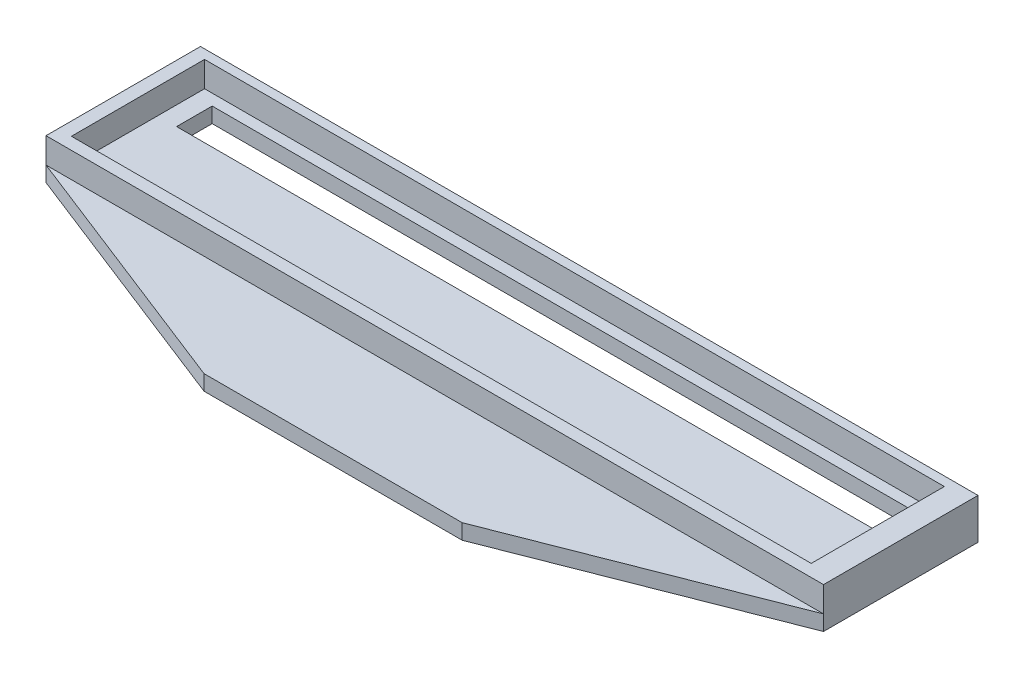
ISO-10303-21;
HEADER;
FILE_DESCRIPTION(('STEP AP214'),'2;1');
FILE_NAME('part.step','',(''),(''),'','','');
FILE_SCHEMA(('AUTOMOTIVE_DESIGN { 1 0 10303 214 1 1 1 1 }'));
ENDSEC;
DATA;
#1=APPLICATION_CONTEXT('core data for automotive mechanical design processes');
#2=APPLICATION_PROTOCOL_DEFINITION('international standard','automotive_design',2000,#1);
#3=PRODUCT_CONTEXT('',#1,'mechanical');
#4=PRODUCT('Part','Part','',(#3));
#5=PRODUCT_RELATED_PRODUCT_CATEGORY('part','',(#4));
#6=PRODUCT_DEFINITION_FORMATION('','',#4);
#7=PRODUCT_DEFINITION_CONTEXT('part definition',#1,'design');
#8=PRODUCT_DEFINITION('design','',#6,#7);
#9=PRODUCT_DEFINITION_SHAPE('','',#8);
#10=(LENGTH_UNIT() NAMED_UNIT(*) SI_UNIT(.MILLI.,.METRE.));
#11=(NAMED_UNIT(*) PLANE_ANGLE_UNIT() SI_UNIT($,.RADIAN.));
#12=(NAMED_UNIT(*) SI_UNIT($,.STERADIAN.) SOLID_ANGLE_UNIT());
#13=UNCERTAINTY_MEASURE_WITH_UNIT(LENGTH_MEASURE(1.E-05),#10,'distance_accuracy_value','');
#14=(GEOMETRIC_REPRESENTATION_CONTEXT(3) GLOBAL_UNCERTAINTY_ASSIGNED_CONTEXT((#13)) GLOBAL_UNIT_ASSIGNED_CONTEXT((#10,
#11,#12)) REPRESENTATION_CONTEXT('',''));
#15=CARTESIAN_POINT('',(0.,0.,0.));
#16=DIRECTION('',(0.,0.,1.));
#17=DIRECTION('',(1.,0.,0.));
#18=AXIS2_PLACEMENT_3D('',#15,#16,#17);
#19=CARTESIAN_POINT('',(-38.25,4.,7.6));
#20=DIRECTION('',(0.,0.,-1.));
#21=DIRECTION('',(-1.,0.,0.));
#22=AXIS2_PLACEMENT_3D('',#19,#20,#21);
#23=PLANE('',#22);
#24=DIRECTION('',(-1.,0.,0.));
#25=VECTOR('',#24,1.);
#26=CARTESIAN_POINT('',(-38.25,1.5,7.6));
#27=LINE('',#26,#25);
#28=CARTESIAN_POINT('',(38.25,1.5,7.6));
#29=VERTEX_POINT('',#28);
#30=CARTESIAN_POINT('',(-38.25,1.5,7.6));
#31=VERTEX_POINT('',#30);
#32=EDGE_CURVE('E55',#29,#31,#27,.T.);
#33=ORIENTED_EDGE('',*,*,#32,.F.);
#34=DIRECTION('',(0.,-1.,0.));
#35=VECTOR('',#34,1.);
#36=CARTESIAN_POINT('',(38.25,4.,7.6));
#37=LINE('',#36,#35);
#38=CARTESIAN_POINT('',(38.25,4.,7.6));
#39=VERTEX_POINT('',#38);
#40=EDGE_CURVE('E277',#39,#29,#37,.T.);
#41=ORIENTED_EDGE('',*,*,#40,.F.);
#42=DIRECTION('',(1.,0.,0.));
#43=VECTOR('',#42,1.);
#44=CARTESIAN_POINT('',(-38.25,4.,7.6));
#45=LINE('',#44,#43);
#46=CARTESIAN_POINT('',(-38.25,4.,7.6));
#47=VERTEX_POINT('',#46);
#48=EDGE_CURVE('E274',#47,#39,#45,.T.);
#49=ORIENTED_EDGE('',*,*,#48,.F.);
#50=DIRECTION('',(0.,-1.,0.));
#51=VECTOR('',#50,1.);
#52=CARTESIAN_POINT('',(-38.25,4.,7.6));
#53=LINE('',#52,#51);
#54=EDGE_CURVE('E288',#47,#31,#53,.T.);
#55=ORIENTED_EDGE('',*,*,#54,.T.);
#56=EDGE_LOOP('',(#33,#41,#49,#55));
#57=FACE_BOUND('',#56,.T.);
#58=ADVANCED_FACE('F39',(#57),#23,.F.);
#59=CARTESIAN_POINT('',(-35.1,0.,-5.6));
#60=DIRECTION('',(-1.,0.,0.));
#61=DIRECTION('',(0.,0.,1.));
#62=AXIS2_PLACEMENT_3D('',#59,#60,#61);
#63=PLANE('',#62);
#64=DIRECTION('',(0.,0.,-1.));
#65=VECTOR('',#64,1.);
#66=CARTESIAN_POINT('',(-35.1,1.5,-5.6));
#67=LINE('',#66,#65);
#68=CARTESIAN_POINT('',(-35.1,1.5,-2.1));
#69=VERTEX_POINT('',#68);
#70=CARTESIAN_POINT('',(-35.1,1.5,-5.6));
#71=VERTEX_POINT('',#70);
#72=EDGE_CURVE('E227',#69,#71,#67,.T.);
#73=ORIENTED_EDGE('',*,*,#72,.F.);
#74=DIRECTION('',(0.,1.,0.));
#75=VECTOR('',#74,1.);
#76=CARTESIAN_POINT('',(-35.1,0.,-2.1));
#77=LINE('',#76,#75);
#78=CARTESIAN_POINT('',(-35.1,0.,-2.1));
#79=VERTEX_POINT('',#78);
#80=EDGE_CURVE('E246',#79,#69,#77,.T.);
#81=ORIENTED_EDGE('',*,*,#80,.F.);
#82=DIRECTION('',(0.,0.,1.));
#83=VECTOR('',#82,1.);
#84=CARTESIAN_POINT('',(-35.1,0.,-5.6));
#85=LINE('',#84,#83);
#86=CARTESIAN_POINT('',(-35.1,0.,-5.6));
#87=VERTEX_POINT('',#86);
#88=EDGE_CURVE('E230',#87,#79,#85,.T.);
#89=ORIENTED_EDGE('',*,*,#88,.F.);
#90=DIRECTION('',(0.,1.,0.));
#91=VECTOR('',#90,1.);
#92=CARTESIAN_POINT('',(-35.1,0.,-5.6));
#93=LINE('',#92,#91);
#94=EDGE_CURVE('E247',#87,#71,#93,.T.);
#95=ORIENTED_EDGE('',*,*,#94,.T.);
#96=EDGE_LOOP('',(#73,#81,#89,#95));
#97=FACE_BOUND('',#96,.T.);
#98=ADVANCED_FACE('F335',(#97),#63,.F.);
#99=CARTESIAN_POINT('',(-35.1,0.,-5.6));
#100=DIRECTION('',(0.,0.,-1.));
#101=DIRECTION('',(-1.,0.,0.));
#102=AXIS2_PLACEMENT_3D('',#99,#100,#101);
#103=PLANE('',#102);
#104=DIRECTION('',(1.,0.,0.));
#105=VECTOR('',#104,1.);
#106=CARTESIAN_POINT('',(-35.1,1.5,-5.6));
#107=LINE('',#106,#105);
#108=CARTESIAN_POINT('',(35.1,1.5,-5.6));
#109=VERTEX_POINT('',#108);
#110=EDGE_CURVE('E224',#71,#109,#107,.T.);
#111=ORIENTED_EDGE('',*,*,#110,.F.);
#112=ORIENTED_EDGE('',*,*,#94,.F.);
#113=DIRECTION('',(-1.,0.,0.));
#114=VECTOR('',#113,1.);
#115=CARTESIAN_POINT('',(-35.1,0.,-5.6));
#116=LINE('',#115,#114);
#117=CARTESIAN_POINT('',(35.1,0.,-5.6));
#118=VERTEX_POINT('',#117);
#119=EDGE_CURVE('E242',#118,#87,#116,.T.);
#120=ORIENTED_EDGE('',*,*,#119,.F.);
#121=DIRECTION('',(0.,1.,0.));
#122=VECTOR('',#121,1.);
#123=CARTESIAN_POINT('',(35.1,0.,-5.6));
#124=LINE('',#123,#122);
#125=EDGE_CURVE('E252',#118,#109,#124,.T.);
#126=ORIENTED_EDGE('',*,*,#125,.T.);
#127=EDGE_LOOP('',(#111,#112,#120,#126));
#128=FACE_BOUND('',#127,.T.);
#129=ADVANCED_FACE('F340',(#128),#103,.F.);
#130=CARTESIAN_POINT('',(35.1,0.,-5.6));
#131=DIRECTION('',(1.,0.,0.));
#132=DIRECTION('',(0.,0.,-1.));
#133=AXIS2_PLACEMENT_3D('',#130,#131,#132);
#134=PLANE('',#133);
#135=DIRECTION('',(0.,0.,1.));
#136=VECTOR('',#135,1.);
#137=CARTESIAN_POINT('',(35.1,1.5,-5.6));
#138=LINE('',#137,#136);
#139=CARTESIAN_POINT('',(35.1,1.5,-2.1));
#140=VERTEX_POINT('',#139);
#141=EDGE_CURVE('E213',#109,#140,#138,.T.);
#142=ORIENTED_EDGE('',*,*,#141,.F.);
#143=ORIENTED_EDGE('',*,*,#125,.F.);
#144=DIRECTION('',(0.,0.,-1.));
#145=VECTOR('',#144,1.);
#146=CARTESIAN_POINT('',(35.1,0.,-5.6));
#147=LINE('',#146,#145);
#148=CARTESIAN_POINT('',(35.1,0.,-2.1));
#149=VERTEX_POINT('',#148);
#150=EDGE_CURVE('E238',#149,#118,#147,.T.);
#151=ORIENTED_EDGE('',*,*,#150,.F.);
#152=DIRECTION('',(0.,1.,0.));
#153=VECTOR('',#152,1.);
#154=CARTESIAN_POINT('',(35.1,0.,-2.1));
#155=LINE('',#154,#153);
#156=EDGE_CURVE('E256',#149,#140,#155,.T.);
#157=ORIENTED_EDGE('',*,*,#156,.T.);
#158=EDGE_LOOP('',(#142,#143,#151,#157));
#159=FACE_BOUND('',#158,.T.);
#160=ADVANCED_FACE('F355',(#159),#134,.F.);
#161=CARTESIAN_POINT('',(-35.1,0.,-2.1));
#162=DIRECTION('',(0.,0.,1.));
#163=DIRECTION('',(1.,0.,0.));
#164=AXIS2_PLACEMENT_3D('',#161,#162,#163);
#165=PLANE('',#164);
#166=DIRECTION('',(-1.,0.,0.));
#167=VECTOR('',#166,1.);
#168=CARTESIAN_POINT('',(-35.1,1.5,-2.1));
#169=LINE('',#168,#167);
#170=EDGE_CURVE('E11',#140,#69,#169,.T.);
#171=ORIENTED_EDGE('',*,*,#170,.F.);
#172=ORIENTED_EDGE('',*,*,#156,.F.);
#173=DIRECTION('',(1.,0.,0.));
#174=VECTOR('',#173,1.);
#175=CARTESIAN_POINT('',(-35.1,0.,-2.1));
#176=LINE('',#175,#174);
#177=EDGE_CURVE('E234',#79,#149,#176,.T.);
#178=ORIENTED_EDGE('',*,*,#177,.F.);
#179=ORIENTED_EDGE('',*,*,#80,.T.);
#180=EDGE_LOOP('',(#171,#172,#178,#179));
#181=FACE_BOUND('',#180,.T.);
#182=ADVANCED_FACE('F351',(#181),#165,.F.);
#183=CARTESIAN_POINT('',(38.25,4.,-7.6));
#184=DIRECTION('',(-1.,0.,0.));
#185=DIRECTION('',(0.,0.,1.));
#186=AXIS2_PLACEMENT_3D('',#183,#184,#185);
#187=PLANE('',#186);
#188=DIRECTION('',(0.,0.,-1.));
#189=VECTOR('',#188,1.);
#190=CARTESIAN_POINT('',(38.25,0.,-7.6));
#191=LINE('',#190,#189);
#192=CARTESIAN_POINT('',(38.25,0.,7.6));
#193=VERTEX_POINT('',#192);
#194=CARTESIAN_POINT('',(38.25,0.,-7.6));
#195=VERTEX_POINT('',#194);
#196=EDGE_CURVE('E251',#193,#195,#191,.T.);
#197=ORIENTED_EDGE('',*,*,#196,.T.);
#198=DIRECTION('',(0.,-1.,0.));
#199=VECTOR('',#198,1.);
#200=CARTESIAN_POINT('',(38.25,4.,-7.6));
#201=LINE('',#200,#199);
#202=CARTESIAN_POINT('',(38.25,4.,-7.6));
#203=VERTEX_POINT('',#202);
#204=EDGE_CURVE('E48',#203,#195,#201,.T.);
#205=ORIENTED_EDGE('',*,*,#204,.F.);
#206=DIRECTION('',(0.,0.,-1.));
#207=VECTOR('',#206,1.);
#208=CARTESIAN_POINT('',(38.25,4.,-7.6));
#209=LINE('',#208,#207);
#210=EDGE_CURVE('E263',#39,#203,#209,.T.);
#211=ORIENTED_EDGE('',*,*,#210,.F.);
#212=ORIENTED_EDGE('',*,*,#40,.T.);
#213=DIRECTION('',(0.,-1.,0.));
#214=VECTOR('',#213,1.);
#215=CARTESIAN_POINT('',(38.25,1.5,7.6));
#216=LINE('',#215,#214);
#217=EDGE_CURVE('E178',#29,#193,#216,.T.);
#218=ORIENTED_EDGE('',*,*,#217,.T.);
#219=EDGE_LOOP('',(#197,#205,#211,#212,#218));
#220=FACE_BOUND('',#219,.T.);
#221=ADVANCED_FACE('F41',(#220),#187,.F.);
#222=CARTESIAN_POINT('',(-38.25,4.,-7.6));
#223=DIRECTION('',(0.,0.,1.));
#224=DIRECTION('',(1.,0.,0.));
#225=AXIS2_PLACEMENT_3D('',#222,#223,#224);
#226=PLANE('',#225);
#227=DIRECTION('',(-1.,0.,0.));
#228=VECTOR('',#227,1.);
#229=CARTESIAN_POINT('',(-38.25,0.,-7.6));
#230=LINE('',#229,#228);
#231=CARTESIAN_POINT('',(-38.25,0.,-7.6));
#232=VERTEX_POINT('',#231);
#233=EDGE_CURVE('E281',#195,#232,#230,.T.);
#234=ORIENTED_EDGE('',*,*,#233,.T.);
#235=DIRECTION('',(0.,-1.,0.));
#236=VECTOR('',#235,1.);
#237=CARTESIAN_POINT('',(-38.25,4.,-7.6));
#238=LINE('',#237,#236);
#239=CARTESIAN_POINT('',(-38.25,4.,-7.6));
#240=VERTEX_POINT('',#239);
#241=EDGE_CURVE('E291',#240,#232,#238,.T.);
#242=ORIENTED_EDGE('',*,*,#241,.F.);
#243=DIRECTION('',(-1.,0.,0.));
#244=VECTOR('',#243,1.);
#245=CARTESIAN_POINT('',(-38.25,4.,-7.6));
#246=LINE('',#245,#244);
#247=EDGE_CURVE('E267',#203,#240,#246,.T.);
#248=ORIENTED_EDGE('',*,*,#247,.F.);
#249=ORIENTED_EDGE('',*,*,#204,.T.);
#250=EDGE_LOOP('',(#234,#242,#248,#249));
#251=FACE_BOUND('',#250,.T.);
#252=ADVANCED_FACE('F298',(#251),#226,.F.);
#253=CARTESIAN_POINT('',(-38.25,4.,-7.6));
#254=DIRECTION('',(1.,0.,0.));
#255=DIRECTION('',(0.,0.,-1.));
#256=AXIS2_PLACEMENT_3D('',#253,#254,#255);
#257=PLANE('',#256);
#258=DIRECTION('',(0.,0.,1.));
#259=VECTOR('',#258,1.);
#260=CARTESIAN_POINT('',(-38.25,0.,-7.6));
#261=LINE('',#260,#259);
#262=CARTESIAN_POINT('',(-38.25,0.,7.6));
#263=VERTEX_POINT('',#262);
#264=EDGE_CURVE('E268',#232,#263,#261,.T.);
#265=ORIENTED_EDGE('',*,*,#264,.T.);
#266=DIRECTION('',(0.,-1.,0.));
#267=VECTOR('',#266,1.);
#268=CARTESIAN_POINT('',(-38.25,1.5,7.6));
#269=LINE('',#268,#267);
#270=EDGE_CURVE('E318',#31,#263,#269,.T.);
#271=ORIENTED_EDGE('',*,*,#270,.F.);
#272=ORIENTED_EDGE('',*,*,#54,.F.);
#273=DIRECTION('',(0.,0.,1.));
#274=VECTOR('',#273,1.);
#275=CARTESIAN_POINT('',(-38.25,4.,-7.6));
#276=LINE('',#275,#274);
#277=EDGE_CURVE('E271',#240,#47,#276,.T.);
#278=ORIENTED_EDGE('',*,*,#277,.F.);
#279=ORIENTED_EDGE('',*,*,#241,.T.);
#280=EDGE_LOOP('',(#265,#271,#272,#278,#279));
#281=FACE_BOUND('',#280,.T.);
#282=ADVANCED_FACE('F329',(#281),#257,.F.);
#283=CARTESIAN_POINT('',(0.,4.,0.));
#284=DIRECTION('',(0.,1.,0.));
#285=DIRECTION('',(0.,0.,1.));
#286=AXIS2_PLACEMENT_3D('',#283,#284,#285);
#287=PLANE('',#286);
#288=DIRECTION('',(0.,0.,1.));
#289=VECTOR('',#288,1.);
#290=CARTESIAN_POINT('',(-36.95,4.,-6.7));
#291=LINE('',#290,#289);
#292=CARTESIAN_POINT('',(-36.95,4.,-6.7));
#293=VERTEX_POINT('',#292);
#294=CARTESIAN_POINT('',(-36.95,4.,6.4));
#295=VERTEX_POINT('',#294);
#296=EDGE_CURVE('E63',#293,#295,#291,.T.);
#297=ORIENTED_EDGE('',*,*,#296,.F.);
#298=DIRECTION('',(-1.,0.,0.));
#299=VECTOR('',#298,1.);
#300=CARTESIAN_POINT('',(-36.95,4.,-6.7));
#301=LINE('',#300,#299);
#302=CARTESIAN_POINT('',(35.8420729644102,4.,-6.7));
#303=VERTEX_POINT('',#302);
#304=EDGE_CURVE('E187',#303,#293,#301,.T.);
#305=ORIENTED_EDGE('',*,*,#304,.F.);
#306=DIRECTION('',(0.,0.,-1.));
#307=VECTOR('',#306,1.);
#308=CARTESIAN_POINT('',(35.8420729644102,4.,-6.7));
#309=LINE('',#308,#307);
#310=CARTESIAN_POINT('',(35.8420729644102,4.,6.4));
#311=VERTEX_POINT('',#310);
#312=EDGE_CURVE('E203',#311,#303,#309,.T.);
#313=ORIENTED_EDGE('',*,*,#312,.F.);
#314=DIRECTION('',(1.,0.,0.));
#315=VECTOR('',#314,1.);
#316=CARTESIAN_POINT('',(-36.95,4.,6.4));
#317=LINE('',#316,#315);
#318=EDGE_CURVE('E176',#295,#311,#317,.T.);
#319=ORIENTED_EDGE('',*,*,#318,.F.);
#320=EDGE_LOOP('',(#297,#305,#313,#319));
#321=FACE_BOUND('',#320,.T.);
#322=ORIENTED_EDGE('',*,*,#210,.T.);
#323=ORIENTED_EDGE('',*,*,#247,.T.);
#324=ORIENTED_EDGE('',*,*,#277,.T.);
#325=ORIENTED_EDGE('',*,*,#48,.T.);
#326=EDGE_LOOP('',(#322,#323,#324,#325));
#327=FACE_BOUND('',#326,.T.);
#328=ADVANCED_FACE('F333',(#321,#327),#287,.T.);
#329=CARTESIAN_POINT('',(0.,0.,0.));
#330=DIRECTION('',(0.,1.,0.));
#331=DIRECTION('',(0.,0.,1.));
#332=AXIS2_PLACEMENT_3D('',#329,#330,#331);
#333=PLANE('',#332);
#334=ORIENTED_EDGE('',*,*,#119,.T.);
#335=ORIENTED_EDGE('',*,*,#88,.T.);
#336=ORIENTED_EDGE('',*,*,#177,.T.);
#337=ORIENTED_EDGE('',*,*,#150,.T.);
#338=EDGE_LOOP('',(#334,#335,#336,#337));
#339=FACE_BOUND('',#338,.T.);
#340=ORIENTED_EDGE('',*,*,#196,.F.);
#341=DIRECTION('',(0.931215890182904,0.,-0.364468058780001));
#342=VECTOR('',#341,1.);
#343=CARTESIAN_POINT('',(38.25,0.,7.6));
#344=LINE('',#343,#342);
#345=CARTESIAN_POINT('',(12.7,0.,17.6));
#346=VERTEX_POINT('',#345);
#347=EDGE_CURVE('E167',#346,#193,#344,.T.);
#348=ORIENTED_EDGE('',*,*,#347,.F.);
#349=DIRECTION('',(1.,0.,0.));
#350=VECTOR('',#349,1.);
#351=CARTESIAN_POINT('',(-12.7,0.,17.6));
#352=LINE('',#351,#350);
#353=CARTESIAN_POINT('',(-12.7,0.,17.6));
#354=VERTEX_POINT('',#353);
#355=EDGE_CURVE('E312',#354,#346,#352,.T.);
#356=ORIENTED_EDGE('',*,*,#355,.F.);
#357=DIRECTION('',(0.931215890182904,0.,0.364468058780001));
#358=VECTOR('',#357,1.);
#359=CARTESIAN_POINT('',(-12.7,0.,17.6));
#360=LINE('',#359,#358);
#361=EDGE_CURVE('E171',#263,#354,#360,.T.);
#362=ORIENTED_EDGE('',*,*,#361,.F.);
#363=ORIENTED_EDGE('',*,*,#264,.F.);
#364=ORIENTED_EDGE('',*,*,#233,.F.);
#365=EDGE_LOOP('',(#340,#348,#356,#362,#363,#364));
#366=FACE_BOUND('',#365,.T.);
#367=ADVANCED_FACE('F307',(#339,#366),#333,.F.);
#368=CARTESIAN_POINT('',(0.,1.5,0.));
#369=DIRECTION('',(0.,1.,0.));
#370=DIRECTION('',(0.,0.,1.));
#371=AXIS2_PLACEMENT_3D('',#368,#369,#370);
#372=PLANE('',#371);
#373=DIRECTION('',(0.,0.,1.));
#374=VECTOR('',#373,1.);
#375=CARTESIAN_POINT('',(-36.95,1.5,-6.7));
#376=LINE('',#375,#374);
#377=CARTESIAN_POINT('',(-36.95,1.5,-6.7));
#378=VERTEX_POINT('',#377);
#379=CARTESIAN_POINT('',(-36.95,1.5,6.4));
#380=VERTEX_POINT('',#379);
#381=EDGE_CURVE('E182',#378,#380,#376,.T.);
#382=ORIENTED_EDGE('',*,*,#381,.T.);
#383=DIRECTION('',(1.,0.,0.));
#384=VECTOR('',#383,1.);
#385=CARTESIAN_POINT('',(-36.95,1.5,6.4));
#386=LINE('',#385,#384);
#387=CARTESIAN_POINT('',(35.8420729644102,1.5,6.4));
#388=VERTEX_POINT('',#387);
#389=EDGE_CURVE('E186',#380,#388,#386,.T.);
#390=ORIENTED_EDGE('',*,*,#389,.T.);
#391=DIRECTION('',(0.,0.,-1.));
#392=VECTOR('',#391,1.);
#393=CARTESIAN_POINT('',(35.8420729644102,1.5,-6.7));
#394=LINE('',#393,#392);
#395=CARTESIAN_POINT('',(35.8420729644102,1.5,-6.7));
#396=VERTEX_POINT('',#395);
#397=EDGE_CURVE('E191',#388,#396,#394,.T.);
#398=ORIENTED_EDGE('',*,*,#397,.T.);
#399=DIRECTION('',(-1.,0.,0.));
#400=VECTOR('',#399,1.);
#401=CARTESIAN_POINT('',(-36.95,1.5,-6.7));
#402=LINE('',#401,#400);
#403=EDGE_CURVE('E195',#396,#378,#402,.T.);
#404=ORIENTED_EDGE('',*,*,#403,.T.);
#405=EDGE_LOOP('',(#382,#390,#398,#404));
#406=FACE_BOUND('',#405,.T.);
#407=ORIENTED_EDGE('',*,*,#72,.T.);
#408=ORIENTED_EDGE('',*,*,#110,.T.);
#409=ORIENTED_EDGE('',*,*,#141,.T.);
#410=ORIENTED_EDGE('',*,*,#170,.T.);
#411=EDGE_LOOP('',(#407,#408,#409,#410));
#412=FACE_BOUND('',#411,.T.);
#413=ADVANCED_FACE('F370',(#406,#412),#372,.T.);
#414=CARTESIAN_POINT('',(-36.95,1.5,-6.7));
#415=DIRECTION('',(-1.,0.,0.));
#416=DIRECTION('',(0.,0.,1.));
#417=AXIS2_PLACEMENT_3D('',#414,#415,#416);
#418=PLANE('',#417);
#419=ORIENTED_EDGE('',*,*,#296,.T.);
#420=DIRECTION('',(0.,1.,0.));
#421=VECTOR('',#420,1.);
#422=CARTESIAN_POINT('',(-36.95,1.5,6.4));
#423=LINE('',#422,#421);
#424=EDGE_CURVE('E198',#380,#295,#423,.T.);
#425=ORIENTED_EDGE('',*,*,#424,.F.);
#426=ORIENTED_EDGE('',*,*,#381,.F.);
#427=DIRECTION('',(0.,1.,0.));
#428=VECTOR('',#427,1.);
#429=CARTESIAN_POINT('',(-36.95,1.5,-6.7));
#430=LINE('',#429,#428);
#431=EDGE_CURVE('E210',#378,#293,#430,.T.);
#432=ORIENTED_EDGE('',*,*,#431,.T.);
#433=EDGE_LOOP('',(#419,#425,#426,#432));
#434=FACE_BOUND('',#433,.T.);
#435=ADVANCED_FACE('F380',(#434),#418,.F.);
#436=CARTESIAN_POINT('',(-36.95,1.5,-6.7));
#437=DIRECTION('',(0.,0.,-1.));
#438=DIRECTION('',(-1.,0.,0.));
#439=AXIS2_PLACEMENT_3D('',#436,#437,#438);
#440=PLANE('',#439);
#441=ORIENTED_EDGE('',*,*,#304,.T.);
#442=ORIENTED_EDGE('',*,*,#431,.F.);
#443=ORIENTED_EDGE('',*,*,#403,.F.);
#444=DIRECTION('',(0.,1.,0.));
#445=VECTOR('',#444,1.);
#446=CARTESIAN_POINT('',(35.8420729644102,1.5,-6.7));
#447=LINE('',#446,#445);
#448=EDGE_CURVE('E214',#396,#303,#447,.T.);
#449=ORIENTED_EDGE('',*,*,#448,.T.);
#450=EDGE_LOOP('',(#441,#442,#443,#449));
#451=FACE_BOUND('',#450,.T.);
#452=ADVANCED_FACE('F385',(#451),#440,.F.);
#453=CARTESIAN_POINT('',(35.8420729644102,1.5,-6.7));
#454=DIRECTION('',(1.,0.,0.));
#455=DIRECTION('',(0.,0.,-1.));
#456=AXIS2_PLACEMENT_3D('',#453,#454,#455);
#457=PLANE('',#456);
#458=ORIENTED_EDGE('',*,*,#312,.T.);
#459=ORIENTED_EDGE('',*,*,#448,.F.);
#460=ORIENTED_EDGE('',*,*,#397,.F.);
#461=DIRECTION('',(0.,1.,0.));
#462=VECTOR('',#461,1.);
#463=CARTESIAN_POINT('',(35.8420729644102,1.5,6.4));
#464=LINE('',#463,#462);
#465=EDGE_CURVE('E217',#388,#311,#464,.T.);
#466=ORIENTED_EDGE('',*,*,#465,.T.);
#467=EDGE_LOOP('',(#458,#459,#460,#466));
#468=FACE_BOUND('',#467,.T.);
#469=ADVANCED_FACE('F387',(#468),#457,.F.);
#470=CARTESIAN_POINT('',(-36.95,1.5,6.4));
#471=DIRECTION('',(0.,0.,1.));
#472=DIRECTION('',(1.,0.,0.));
#473=AXIS2_PLACEMENT_3D('',#470,#471,#472);
#474=PLANE('',#473);
#475=ORIENTED_EDGE('',*,*,#318,.T.);
#476=ORIENTED_EDGE('',*,*,#465,.F.);
#477=ORIENTED_EDGE('',*,*,#389,.F.);
#478=ORIENTED_EDGE('',*,*,#424,.T.);
#479=EDGE_LOOP('',(#475,#476,#477,#478));
#480=FACE_BOUND('',#479,.T.);
#481=ADVANCED_FACE('F376',(#480),#474,.F.);
#482=CARTESIAN_POINT('',(-12.7,1.5,17.6));
#483=DIRECTION('',(0.364468058780001,0.,-0.931215890182904));
#484=DIRECTION('',(-0.931215890182904,0.,-0.364468058780001));
#485=AXIS2_PLACEMENT_3D('',#482,#483,#484);
#486=PLANE('',#485);
#487=ORIENTED_EDGE('',*,*,#361,.T.);
#488=DIRECTION('',(0.,-1.,0.));
#489=VECTOR('',#488,1.);
#490=CARTESIAN_POINT('',(-12.7,1.5,17.6));
#491=LINE('',#490,#489);
#492=CARTESIAN_POINT('',(-12.7,1.5,17.6));
#493=VERTEX_POINT('',#492);
#494=EDGE_CURVE('E151',#493,#354,#491,.T.);
#495=ORIENTED_EDGE('',*,*,#494,.F.);
#496=DIRECTION('',(0.931215890182904,0.,0.364468058780001));
#497=VECTOR('',#496,1.);
#498=CARTESIAN_POINT('',(-12.7,1.5,17.6));
#499=LINE('',#498,#497);
#500=EDGE_CURVE('E160',#31,#493,#499,.T.);
#501=ORIENTED_EDGE('',*,*,#500,.F.);
#502=ORIENTED_EDGE('',*,*,#270,.T.);
#503=EDGE_LOOP('',(#487,#495,#501,#502));
#504=FACE_BOUND('',#503,.T.);
#505=ADVANCED_FACE('F169',(#504),#486,.F.);
#506=CARTESIAN_POINT('',(-12.7,1.5,17.6));
#507=DIRECTION('',(0.,0.,-1.));
#508=DIRECTION('',(-1.,0.,0.));
#509=AXIS2_PLACEMENT_3D('',#506,#507,#508);
#510=PLANE('',#509);
#511=ORIENTED_EDGE('',*,*,#355,.T.);
#512=DIRECTION('',(0.,-1.,0.));
#513=VECTOR('',#512,1.);
#514=CARTESIAN_POINT('',(12.7,1.5,17.6));
#515=LINE('',#514,#513);
#516=CARTESIAN_POINT('',(12.7,1.5,17.6));
#517=VERTEX_POINT('',#516);
#518=EDGE_CURVE('E154',#517,#346,#515,.T.);
#519=ORIENTED_EDGE('',*,*,#518,.F.);
#520=DIRECTION('',(1.,0.,0.));
#521=VECTOR('',#520,1.);
#522=CARTESIAN_POINT('',(-12.7,1.5,17.6));
#523=LINE('',#522,#521);
#524=EDGE_CURVE('E147',#493,#517,#523,.T.);
#525=ORIENTED_EDGE('',*,*,#524,.F.);
#526=ORIENTED_EDGE('',*,*,#494,.T.);
#527=EDGE_LOOP('',(#511,#519,#525,#526));
#528=FACE_BOUND('',#527,.T.);
#529=ADVANCED_FACE('F149',(#528),#510,.F.);
#530=CARTESIAN_POINT('',(38.25,1.5,7.6));
#531=DIRECTION('',(-0.364468058780001,0.,-0.931215890182903));
#532=DIRECTION('',(-0.931215890182904,0.,0.364468058780001));
#533=AXIS2_PLACEMENT_3D('',#530,#531,#532);
#534=PLANE('',#533);
#535=ORIENTED_EDGE('',*,*,#347,.T.);
#536=ORIENTED_EDGE('',*,*,#217,.F.);
#537=DIRECTION('',(0.931215890182904,0.,-0.364468058780001));
#538=VECTOR('',#537,1.);
#539=CARTESIAN_POINT('',(38.25,1.5,7.6));
#540=LINE('',#539,#538);
#541=EDGE_CURVE('E159',#517,#29,#540,.T.);
#542=ORIENTED_EDGE('',*,*,#541,.F.);
#543=ORIENTED_EDGE('',*,*,#518,.T.);
#544=EDGE_LOOP('',(#535,#536,#542,#543));
#545=FACE_BOUND('',#544,.T.);
#546=ADVANCED_FACE('F310',(#545),#534,.F.);
#547=CARTESIAN_POINT('',(0.,1.5,0.));
#548=DIRECTION('',(0.,1.,0.));
#549=DIRECTION('',(0.,0.,1.));
#550=AXIS2_PLACEMENT_3D('',#547,#548,#549);
#551=PLANE('',#550);
#552=ORIENTED_EDGE('',*,*,#500,.T.);
#553=ORIENTED_EDGE('',*,*,#524,.T.);
#554=ORIENTED_EDGE('',*,*,#541,.T.);
#555=ORIENTED_EDGE('',*,*,#32,.T.);
#556=EDGE_LOOP('',(#552,#553,#554,#555));
#557=FACE_BOUND('',#556,.T.);
#558=ADVANCED_FACE('F163',(#557),#551,.T.);
#559=CLOSED_SHELL('',(#58,#98,#129,#160,#182,#221,#252,#282,#328,#367,#413,#435,#452,#469,#481,
#505,#529,#546,#558));
#560=MANIFOLD_SOLID_BREP('B2',#559);
#561=ADVANCED_BREP_SHAPE_REPRESENTATION('',(#18,#560),#14);
#562=SHAPE_DEFINITION_REPRESENTATION(#9,#561);
ENDSEC;
END-ISO-10303-21;
